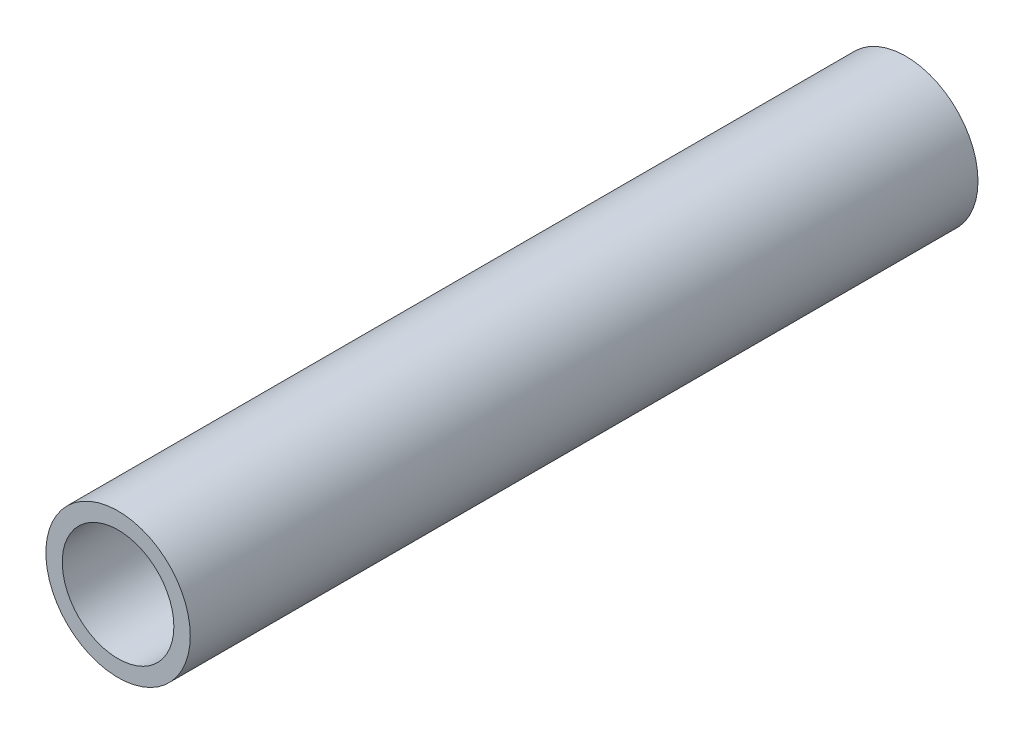
ISO-10303-21;
HEADER;
FILE_DESCRIPTION(('STEP AP214'),'2;1');
FILE_NAME('part.step','',(''),(''),'','','');
FILE_SCHEMA(('AUTOMOTIVE_DESIGN { 1 0 10303 214 1 1 1 1 }'));
ENDSEC;
DATA;
#1=APPLICATION_CONTEXT('core data for automotive mechanical design processes');
#2=APPLICATION_PROTOCOL_DEFINITION('international standard','automotive_design',2000,#1);
#3=PRODUCT_CONTEXT('',#1,'mechanical');
#4=PRODUCT('Part','Part','',(#3));
#5=PRODUCT_RELATED_PRODUCT_CATEGORY('part','',(#4));
#6=PRODUCT_DEFINITION_FORMATION('','',#4);
#7=PRODUCT_DEFINITION_CONTEXT('part definition',#1,'design');
#8=PRODUCT_DEFINITION('design','',#6,#7);
#9=PRODUCT_DEFINITION_SHAPE('','',#8);
#10=(LENGTH_UNIT() NAMED_UNIT(*) SI_UNIT(.MILLI.,.METRE.));
#11=(NAMED_UNIT(*) PLANE_ANGLE_UNIT() SI_UNIT($,.RADIAN.));
#12=(NAMED_UNIT(*) SI_UNIT($,.STERADIAN.) SOLID_ANGLE_UNIT());
#13=UNCERTAINTY_MEASURE_WITH_UNIT(LENGTH_MEASURE(1.E-05),#10,'distance_accuracy_value','');
#14=(GEOMETRIC_REPRESENTATION_CONTEXT(3) GLOBAL_UNCERTAINTY_ASSIGNED_CONTEXT((#13)) GLOBAL_UNIT_ASSIGNED_CONTEXT((#10,
#11,#12)) REPRESENTATION_CONTEXT('',''));
#15=CARTESIAN_POINT('',(0.,0.,0.));
#16=DIRECTION('',(0.,0.,1.));
#17=DIRECTION('',(1.,0.,0.));
#18=AXIS2_PLACEMENT_3D('',#15,#16,#17);
#19=CARTESIAN_POINT('',(0.,0.,120.));
#20=DIRECTION('',(0.,0.,1.));
#21=DIRECTION('',(1.,0.,0.));
#22=AXIS2_PLACEMENT_3D('',#19,#20,#21);
#23=PLANE('',#22);
#24=CARTESIAN_POINT('',(0.,0.,120.));
#25=DIRECTION('',(0.,0.,1.));
#26=DIRECTION('',(1.,0.,0.));
#27=AXIS2_PLACEMENT_3D('',#24,#25,#26);
#28=CIRCLE('',#27,11.);
#29=CARTESIAN_POINT('',(11.,0.,120.));
#30=VERTEX_POINT('',#29);
#31=EDGE_CURVE('E10',#30,#30,#28,.T.);
#32=ORIENTED_EDGE('',*,*,#31,.T.);
#33=EDGE_LOOP('',(#32));
#34=FACE_BOUND('',#33,.T.);
#35=CARTESIAN_POINT('',(0.,0.,120.));
#36=DIRECTION('',(0.,0.,1.));
#37=DIRECTION('',(1.,0.,0.));
#38=AXIS2_PLACEMENT_3D('',#35,#36,#37);
#39=CIRCLE('',#38,8.5);
#40=CARTESIAN_POINT('',(8.5,0.,120.));
#41=VERTEX_POINT('',#40);
#42=EDGE_CURVE('E42',#41,#41,#39,.T.);
#43=ORIENTED_EDGE('',*,*,#42,.F.);
#44=EDGE_LOOP('',(#43));
#45=FACE_BOUND('',#44,.T.);
#46=ADVANCED_FACE('F31',(#34,#45),#23,.T.);
#47=CARTESIAN_POINT('',(0.,0.,0.));
#48=DIRECTION('',(0.,0.,1.));
#49=DIRECTION('',(1.,0.,0.));
#50=AXIS2_PLACEMENT_3D('',#47,#48,#49);
#51=PLANE('',#50);
#52=CARTESIAN_POINT('',(0.,0.,0.));
#53=DIRECTION('',(0.,0.,1.));
#54=DIRECTION('',(1.,0.,0.));
#55=AXIS2_PLACEMENT_3D('',#52,#53,#54);
#56=CIRCLE('',#55,11.);
#57=CARTESIAN_POINT('',(11.,0.,0.));
#58=VERTEX_POINT('',#57);
#59=EDGE_CURVE('E35',#58,#58,#56,.T.);
#60=ORIENTED_EDGE('',*,*,#59,.F.);
#61=EDGE_LOOP('',(#60));
#62=FACE_BOUND('',#61,.T.);
#63=CARTESIAN_POINT('',(0.,0.,0.));
#64=DIRECTION('',(0.,0.,1.));
#65=DIRECTION('',(1.,0.,0.));
#66=AXIS2_PLACEMENT_3D('',#63,#64,#65);
#67=CIRCLE('',#66,8.5);
#68=CARTESIAN_POINT('',(8.5,0.,0.));
#69=VERTEX_POINT('',#68);
#70=EDGE_CURVE('E44',#69,#69,#67,.T.);
#71=ORIENTED_EDGE('',*,*,#70,.T.);
#72=EDGE_LOOP('',(#71));
#73=FACE_BOUND('',#72,.T.);
#74=ADVANCED_FACE('F54',(#62,#73),#51,.F.);
#75=CARTESIAN_POINT('',(0.,0.,120.));
#76=DIRECTION('',(0.,0.,-1.));
#77=DIRECTION('',(-1.,0.,0.));
#78=AXIS2_PLACEMENT_3D('',#75,#76,#77);
#79=CYLINDRICAL_SURFACE('',#78,11.);
#80=ORIENTED_EDGE('',*,*,#31,.F.);
#81=EDGE_LOOP('',(#80));
#82=FACE_BOUND('',#81,.T.);
#83=ORIENTED_EDGE('',*,*,#59,.T.);
#84=EDGE_LOOP('',(#83));
#85=FACE_BOUND('',#84,.T.);
#86=ADVANCED_FACE('F33',(#82,#85),#79,.T.);
#87=CARTESIAN_POINT('',(0.,0.,120.));
#88=DIRECTION('',(0.,0.,-1.));
#89=DIRECTION('',(-1.,0.,0.));
#90=AXIS2_PLACEMENT_3D('',#87,#88,#89);
#91=CYLINDRICAL_SURFACE('',#90,8.5);
#92=ORIENTED_EDGE('',*,*,#42,.T.);
#93=EDGE_LOOP('',(#92));
#94=FACE_BOUND('',#93,.T.);
#95=ORIENTED_EDGE('',*,*,#70,.F.);
#96=EDGE_LOOP('',(#95));
#97=FACE_BOUND('',#96,.T.);
#98=ADVANCED_FACE('F50',(#94,#97),#91,.F.);
#99=CLOSED_SHELL('',(#46,#74,#86,#98));
#100=MANIFOLD_SOLID_BREP('B2',#99);
#101=ADVANCED_BREP_SHAPE_REPRESENTATION('',(#18,#100),#14);
#102=SHAPE_DEFINITION_REPRESENTATION(#9,#101);
ENDSEC;
END-ISO-10303-21;
